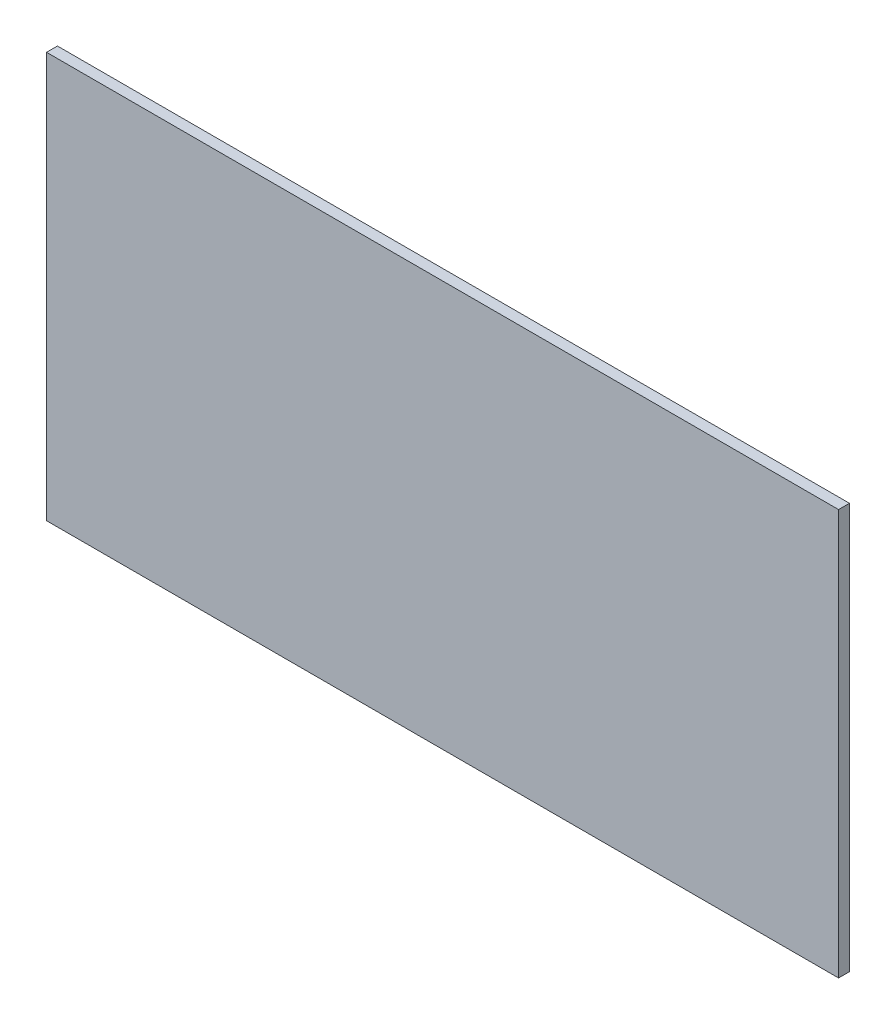
ISO-10303-21;
HEADER;
FILE_DESCRIPTION(('STEP AP214'),'2;1');
FILE_NAME('part.step','',(''),(''),'','','');
FILE_SCHEMA(('AUTOMOTIVE_DESIGN { 1 0 10303 214 1 1 1 1 }'));
ENDSEC;
DATA;
#1=APPLICATION_CONTEXT('core data for automotive mechanical design processes');
#2=APPLICATION_PROTOCOL_DEFINITION('international standard','automotive_design',2000,#1);
#3=PRODUCT_CONTEXT('',#1,'mechanical');
#4=PRODUCT('Part','Part','',(#3));
#5=PRODUCT_RELATED_PRODUCT_CATEGORY('part','',(#4));
#6=PRODUCT_DEFINITION_FORMATION('','',#4);
#7=PRODUCT_DEFINITION_CONTEXT('part definition',#1,'design');
#8=PRODUCT_DEFINITION('design','',#6,#7);
#9=PRODUCT_DEFINITION_SHAPE('','',#8);
#10=(LENGTH_UNIT() NAMED_UNIT(*) SI_UNIT(.MILLI.,.METRE.));
#11=(NAMED_UNIT(*) PLANE_ANGLE_UNIT() SI_UNIT($,.RADIAN.));
#12=(NAMED_UNIT(*) SI_UNIT($,.STERADIAN.) SOLID_ANGLE_UNIT());
#13=UNCERTAINTY_MEASURE_WITH_UNIT(LENGTH_MEASURE(1.E-05),#10,'distance_accuracy_value','');
#14=(GEOMETRIC_REPRESENTATION_CONTEXT(3) GLOBAL_UNCERTAINTY_ASSIGNED_CONTEXT((#13)) GLOBAL_UNIT_ASSIGNED_CONTEXT((#10,
#11,#12)) REPRESENTATION_CONTEXT('',''));
#15=CARTESIAN_POINT('',(0.,0.,0.));
#16=DIRECTION('',(0.,0.,1.));
#17=DIRECTION('',(1.,0.,0.));
#18=AXIS2_PLACEMENT_3D('',#15,#16,#17);
#19=CARTESIAN_POINT('',(0.,0.,1.12776));
#20=DIRECTION('',(0.,0.,-1.));
#21=DIRECTION('',(-1.,0.,0.));
#22=AXIS2_PLACEMENT_3D('',#19,#20,#21);
#23=PLANE('',#22);
#24=DIRECTION('',(0.,1.,0.));
#25=VECTOR('',#24,1.);
#26=CARTESIAN_POINT('',(82.0000011,0.,1.12776));
#27=LINE('',#26,#25);
#28=CARTESIAN_POINT('',(82.0000011,0.,1.12776));
#29=VERTEX_POINT('',#28);
#30=CARTESIAN_POINT('',(82.0000011,41.99999982,1.12776));
#31=VERTEX_POINT('',#30);
#32=EDGE_CURVE('E55',#29,#31,#27,.T.);
#33=ORIENTED_EDGE('',*,*,#32,.T.);
#34=DIRECTION('',(1.,0.,0.));
#35=VECTOR('',#34,1.);
#36=CARTESIAN_POINT('',(82.0000011,41.99999982,1.12776));
#37=LINE('',#36,#35);
#38=CARTESIAN_POINT('',(0.,41.99999982,1.12776));
#39=VERTEX_POINT('',#38);
#40=EDGE_CURVE('E57',#31,#39,#37,.F.);
#41=ORIENTED_EDGE('',*,*,#40,.T.);
#42=DIRECTION('',(0.,1.,0.));
#43=VECTOR('',#42,1.);
#44=CARTESIAN_POINT('',(0.,41.99999982,1.12776));
#45=LINE('',#44,#43);
#46=CARTESIAN_POINT('',(0.,0.,1.12776));
#47=VERTEX_POINT('',#46);
#48=EDGE_CURVE('E20',#39,#47,#45,.F.);
#49=ORIENTED_EDGE('',*,*,#48,.T.);
#50=DIRECTION('',(1.,0.,0.));
#51=VECTOR('',#50,1.);
#52=CARTESIAN_POINT('',(0.,0.,1.12776));
#53=LINE('',#52,#51);
#54=EDGE_CURVE('E80',#47,#29,#53,.T.);
#55=ORIENTED_EDGE('',*,*,#54,.T.);
#56=EDGE_LOOP('',(#33,#41,#49,#55));
#57=FACE_BOUND('',#56,.T.);
#58=ADVANCED_FACE('F17',(#57),#23,.F.);
#59=CARTESIAN_POINT('',(0.,41.99999982,0.));
#60=DIRECTION('',(1.,0.,0.));
#61=DIRECTION('',(0.,0.,-1.));
#62=AXIS2_PLACEMENT_3D('',#59,#60,#61);
#63=PLANE('',#62);
#64=DIRECTION('',(0.,0.,1.));
#65=VECTOR('',#64,1.);
#66=CARTESIAN_POINT('',(0.,0.,0.));
#67=LINE('',#66,#65);
#68=CARTESIAN_POINT('',(0.,0.,0.));
#69=VERTEX_POINT('',#68);
#70=EDGE_CURVE('E68',#69,#47,#67,.T.);
#71=ORIENTED_EDGE('',*,*,#70,.T.);
#72=ORIENTED_EDGE('',*,*,#48,.F.);
#73=DIRECTION('',(0.,0.,-1.));
#74=VECTOR('',#73,1.);
#75=CARTESIAN_POINT('',(0.,41.99999982,0.));
#76=LINE('',#75,#74);
#77=CARTESIAN_POINT('',(0.,41.99999982,0.));
#78=VERTEX_POINT('',#77);
#79=EDGE_CURVE('E63',#39,#78,#76,.T.);
#80=ORIENTED_EDGE('',*,*,#79,.T.);
#81=DIRECTION('',(0.,1.,0.));
#82=VECTOR('',#81,1.);
#83=CARTESIAN_POINT('',(0.,0.,0.));
#84=LINE('',#83,#82);
#85=EDGE_CURVE('E83',#69,#78,#84,.T.);
#86=ORIENTED_EDGE('',*,*,#85,.F.);
#87=EDGE_LOOP('',(#71,#72,#80,#86));
#88=FACE_BOUND('',#87,.T.);
#89=ADVANCED_FACE('F65',(#88),#63,.F.);
#90=CARTESIAN_POINT('',(82.0000011,41.99999982,0.));
#91=DIRECTION('',(0.,-1.,0.));
#92=DIRECTION('',(0.,0.,-1.));
#93=AXIS2_PLACEMENT_3D('',#90,#91,#92);
#94=PLANE('',#93);
#95=ORIENTED_EDGE('',*,*,#79,.F.);
#96=ORIENTED_EDGE('',*,*,#40,.F.);
#97=DIRECTION('',(0.,0.,1.));
#98=VECTOR('',#97,1.);
#99=CARTESIAN_POINT('',(82.0000011,41.99999982,0.));
#100=LINE('',#99,#98);
#101=CARTESIAN_POINT('',(82.0000011,41.99999982,0.));
#102=VERTEX_POINT('',#101);
#103=EDGE_CURVE('E75',#31,#102,#100,.F.);
#104=ORIENTED_EDGE('',*,*,#103,.T.);
#105=DIRECTION('',(-1.,0.,0.));
#106=VECTOR('',#105,1.);
#107=CARTESIAN_POINT('',(0.,41.99999982,0.));
#108=LINE('',#107,#106);
#109=EDGE_CURVE('E72',#78,#102,#108,.F.);
#110=ORIENTED_EDGE('',*,*,#109,.F.);
#111=EDGE_LOOP('',(#95,#96,#104,#110));
#112=FACE_BOUND('',#111,.T.);
#113=ADVANCED_FACE('F70',(#112),#94,.F.);
#114=CARTESIAN_POINT('',(82.0000011,0.,0.));
#115=DIRECTION('',(-1.,0.,0.));
#116=DIRECTION('',(0.,0.,1.));
#117=AXIS2_PLACEMENT_3D('',#114,#115,#116);
#118=PLANE('',#117);
#119=ORIENTED_EDGE('',*,*,#103,.F.);
#120=ORIENTED_EDGE('',*,*,#32,.F.);
#121=DIRECTION('',(0.,0.,1.));
#122=VECTOR('',#121,1.);
#123=CARTESIAN_POINT('',(82.0000011,0.,0.));
#124=LINE('',#123,#122);
#125=CARTESIAN_POINT('',(82.0000011,0.,0.));
#126=VERTEX_POINT('',#125);
#127=EDGE_CURVE('E35',#29,#126,#124,.F.);
#128=ORIENTED_EDGE('',*,*,#127,.T.);
#129=DIRECTION('',(0.,1.,0.));
#130=VECTOR('',#129,1.);
#131=CARTESIAN_POINT('',(82.0000011,0.,0.));
#132=LINE('',#131,#130);
#133=EDGE_CURVE('E26',#102,#126,#132,.F.);
#134=ORIENTED_EDGE('',*,*,#133,.F.);
#135=EDGE_LOOP('',(#119,#120,#128,#134));
#136=FACE_BOUND('',#135,.T.);
#137=ADVANCED_FACE('F89',(#136),#118,.F.);
#138=CARTESIAN_POINT('',(0.,0.,0.));
#139=DIRECTION('',(0.,1.,0.));
#140=DIRECTION('',(0.,0.,1.));
#141=AXIS2_PLACEMENT_3D('',#138,#139,#140);
#142=PLANE('',#141);
#143=ORIENTED_EDGE('',*,*,#127,.F.);
#144=ORIENTED_EDGE('',*,*,#54,.F.);
#145=ORIENTED_EDGE('',*,*,#70,.F.);
#146=DIRECTION('',(-1.,0.,0.));
#147=VECTOR('',#146,1.);
#148=CARTESIAN_POINT('',(0.,0.,0.));
#149=LINE('',#148,#147);
#150=EDGE_CURVE('E11',#126,#69,#149,.T.);
#151=ORIENTED_EDGE('',*,*,#150,.F.);
#152=EDGE_LOOP('',(#143,#144,#145,#151));
#153=FACE_BOUND('',#152,.T.);
#154=ADVANCED_FACE('F91',(#153),#142,.F.);
#155=CARTESIAN_POINT('',(0.,0.,0.));
#156=DIRECTION('',(0.,0.,-1.));
#157=DIRECTION('',(-1.,0.,0.));
#158=AXIS2_PLACEMENT_3D('',#155,#156,#157);
#159=PLANE('',#158);
#160=ORIENTED_EDGE('',*,*,#133,.T.);
#161=ORIENTED_EDGE('',*,*,#150,.T.);
#162=ORIENTED_EDGE('',*,*,#85,.T.);
#163=ORIENTED_EDGE('',*,*,#109,.T.);
#164=EDGE_LOOP('',(#160,#161,#162,#163));
#165=FACE_BOUND('',#164,.T.);
#166=ADVANCED_FACE('F88',(#165),#159,.T.);
#167=CLOSED_SHELL('',(#58,#89,#113,#137,#154,#166));
#168=MANIFOLD_SOLID_BREP('B1',#167);
#169=ADVANCED_BREP_SHAPE_REPRESENTATION('',(#18,#168),#14);
#170=SHAPE_DEFINITION_REPRESENTATION(#9,#169);
ENDSEC;
END-ISO-10303-21;
